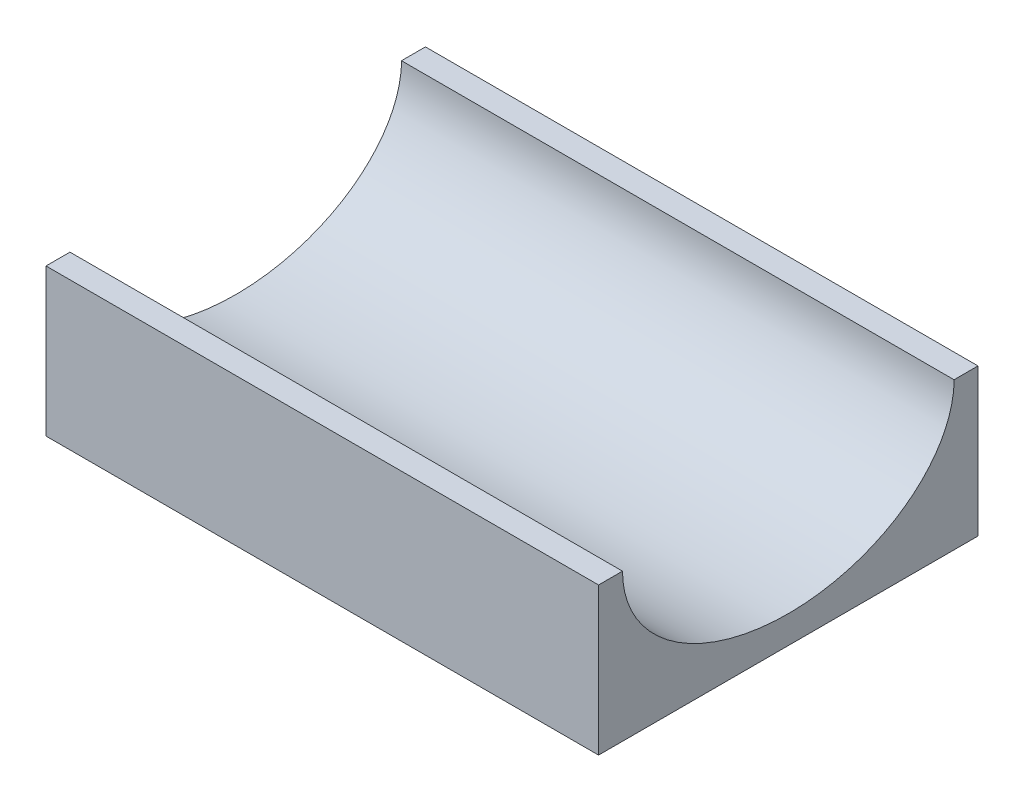
ISO-10303-21;
HEADER;
FILE_DESCRIPTION(('STEP AP214'),'2;1');
FILE_NAME('part.step','',(''),(''),'','','');
FILE_SCHEMA(('AUTOMOTIVE_DESIGN { 1 0 10303 214 1 1 1 1 }'));
ENDSEC;
DATA;
#1=APPLICATION_CONTEXT('core data for automotive mechanical design processes');
#2=APPLICATION_PROTOCOL_DEFINITION('international standard','automotive_design',2000,#1);
#3=PRODUCT_CONTEXT('',#1,'mechanical');
#4=PRODUCT('Part','Part','',(#3));
#5=PRODUCT_RELATED_PRODUCT_CATEGORY('part','',(#4));
#6=PRODUCT_DEFINITION_FORMATION('','',#4);
#7=PRODUCT_DEFINITION_CONTEXT('part definition',#1,'design');
#8=PRODUCT_DEFINITION('design','',#6,#7);
#9=PRODUCT_DEFINITION_SHAPE('','',#8);
#10=(LENGTH_UNIT() NAMED_UNIT(*) SI_UNIT(.MILLI.,.METRE.));
#11=(NAMED_UNIT(*) PLANE_ANGLE_UNIT() SI_UNIT($,.RADIAN.));
#12=(NAMED_UNIT(*) SI_UNIT($,.STERADIAN.) SOLID_ANGLE_UNIT());
#13=UNCERTAINTY_MEASURE_WITH_UNIT(LENGTH_MEASURE(1.E-05),#10,'distance_accuracy_value','');
#14=(GEOMETRIC_REPRESENTATION_CONTEXT(3) GLOBAL_UNCERTAINTY_ASSIGNED_CONTEXT((#13)) GLOBAL_UNIT_ASSIGNED_CONTEXT((#10,
#11,#12)) REPRESENTATION_CONTEXT('',''));
#15=CARTESIAN_POINT('',(0.,0.,0.));
#16=DIRECTION('',(0.,0.,1.));
#17=DIRECTION('',(1.,0.,0.));
#18=AXIS2_PLACEMENT_3D('',#15,#16,#17);
#19=CARTESIAN_POINT('',(0.,-4.7625,0.));
#20=DIRECTION('',(-1.,0.,0.));
#21=DIRECTION('',(0.,0.,1.));
#22=AXIS2_PLACEMENT_3D('',#19,#20,#21);
#23=PLANE('',#22);
#24=CARTESIAN_POINT('',(0.,20.6375,-32.7025));
#25=DIRECTION('',(1.,0.,0.));
#26=DIRECTION('',(0.,0.,1.));
#27=AXIS2_PLACEMENT_3D('',#24,#25,#26);
#28=ELLIPSE('',#27,28.575,20.6375);
#29=CARTESIAN_POINT('',(0.,20.6375,-4.12749999999999));
#30=VERTEX_POINT('',#29);
#31=CARTESIAN_POINT('',(0.,20.6375,-61.2775));
#32=VERTEX_POINT('',#31);
#33=EDGE_CURVE('E121',#30,#32,#28,.T.);
#34=ORIENTED_EDGE('',*,*,#33,.T.);
#35=DIRECTION('',(0.,0.,-1.));
#36=VECTOR('',#35,1.);
#37=CARTESIAN_POINT('',(0.,20.6375,0.));
#38=LINE('',#37,#36);
#39=CARTESIAN_POINT('',(0.,20.6375,-65.405));
#40=VERTEX_POINT('',#39);
#41=EDGE_CURVE('E110',#32,#40,#38,.T.);
#42=ORIENTED_EDGE('',*,*,#41,.T.);
#43=DIRECTION('',(0.,1.,0.));
#44=VECTOR('',#43,1.);
#45=CARTESIAN_POINT('',(0.,-4.7625,-65.405));
#46=LINE('',#45,#44);
#47=CARTESIAN_POINT('',(0.,-4.7625,-65.405));
#48=VERTEX_POINT('',#47);
#49=EDGE_CURVE('E11',#48,#40,#46,.T.);
#50=ORIENTED_EDGE('',*,*,#49,.F.);
#51=DIRECTION('',(0.,0.,1.));
#52=VECTOR('',#51,1.);
#53=CARTESIAN_POINT('',(0.,-4.7625,0.));
#54=LINE('',#53,#52);
#55=CARTESIAN_POINT('',(0.,-4.7625,0.));
#56=VERTEX_POINT('',#55);
#57=EDGE_CURVE('E120',#48,#56,#54,.T.);
#58=ORIENTED_EDGE('',*,*,#57,.T.);
#59=DIRECTION('',(0.,1.,0.));
#60=VECTOR('',#59,1.);
#61=CARTESIAN_POINT('',(0.,-4.7625,0.));
#62=LINE('',#61,#60);
#63=CARTESIAN_POINT('',(0.,20.6375,0.));
#64=VERTEX_POINT('',#63);
#65=EDGE_CURVE('E41',#56,#64,#62,.T.);
#66=ORIENTED_EDGE('',*,*,#65,.T.);
#67=DIRECTION('',(0.,0.,-1.));
#68=VECTOR('',#67,1.);
#69=CARTESIAN_POINT('',(0.,20.6375,0.));
#70=LINE('',#69,#68);
#71=EDGE_CURVE('E117',#64,#30,#70,.T.);
#72=ORIENTED_EDGE('',*,*,#71,.T.);
#73=EDGE_LOOP('',(#34,#42,#50,#58,#66,#72));
#74=FACE_BOUND('',#73,.T.);
#75=ADVANCED_FACE('F38',(#74),#23,.T.);
#76=CARTESIAN_POINT('',(95.25,-4.7625,-65.405));
#77=DIRECTION('',(0.,0.,-1.));
#78=DIRECTION('',(-1.,0.,0.));
#79=AXIS2_PLACEMENT_3D('',#76,#77,#78);
#80=PLANE('',#79);
#81=ORIENTED_EDGE('',*,*,#49,.T.);
#82=DIRECTION('',(-1.,0.,0.));
#83=VECTOR('',#82,1.);
#84=CARTESIAN_POINT('',(133.919883792171,20.6375,-65.405));
#85=LINE('',#84,#83);
#86=CARTESIAN_POINT('',(95.25,20.6375,-65.405));
#87=VERTEX_POINT('',#86);
#88=EDGE_CURVE('E109',#87,#40,#85,.T.);
#89=ORIENTED_EDGE('',*,*,#88,.F.);
#90=DIRECTION('',(0.,1.,0.));
#91=VECTOR('',#90,1.);
#92=CARTESIAN_POINT('',(95.25,-4.7625,-65.405));
#93=LINE('',#92,#91);
#94=CARTESIAN_POINT('',(95.25,-4.7625,-65.405));
#95=VERTEX_POINT('',#94);
#96=EDGE_CURVE('E46',#95,#87,#93,.T.);
#97=ORIENTED_EDGE('',*,*,#96,.F.);
#98=DIRECTION('',(-1.,0.,0.));
#99=VECTOR('',#98,1.);
#100=CARTESIAN_POINT('',(95.25,-4.7625,-65.405));
#101=LINE('',#100,#99);
#102=EDGE_CURVE('E163',#95,#48,#101,.T.);
#103=ORIENTED_EDGE('',*,*,#102,.T.);
#104=EDGE_LOOP('',(#81,#89,#97,#103));
#105=FACE_BOUND('',#104,.T.);
#106=ADVANCED_FACE('F142',(#105),#80,.T.);
#107=CARTESIAN_POINT('',(95.25,-4.7625,0.));
#108=DIRECTION('',(1.,0.,0.));
#109=DIRECTION('',(0.,0.,-1.));
#110=AXIS2_PLACEMENT_3D('',#107,#108,#109);
#111=PLANE('',#110);
#112=ORIENTED_EDGE('',*,*,#96,.T.);
#113=DIRECTION('',(0.,0.,-1.));
#114=VECTOR('',#113,1.);
#115=CARTESIAN_POINT('',(95.25,20.6375,0.));
#116=LINE('',#115,#114);
#117=CARTESIAN_POINT('',(95.25,20.6375,-61.2775));
#118=VERTEX_POINT('',#117);
#119=EDGE_CURVE('E105',#118,#87,#116,.T.);
#120=ORIENTED_EDGE('',*,*,#119,.F.);
#121=CARTESIAN_POINT('',(95.25,20.6375,-32.7025));
#122=DIRECTION('',(1.,0.,0.));
#123=DIRECTION('',(0.,0.,1.));
#124=AXIS2_PLACEMENT_3D('',#121,#122,#123);
#125=ELLIPSE('',#124,28.575,20.6375);
#126=CARTESIAN_POINT('',(95.25,20.6375,-4.12749999999999));
#127=VERTEX_POINT('',#126);
#128=EDGE_CURVE('E92',#127,#118,#125,.T.);
#129=ORIENTED_EDGE('',*,*,#128,.F.);
#130=DIRECTION('',(0.,0.,-1.));
#131=VECTOR('',#130,1.);
#132=CARTESIAN_POINT('',(95.25,20.6375,0.));
#133=LINE('',#132,#131);
#134=CARTESIAN_POINT('',(95.25,20.6375,0.));
#135=VERTEX_POINT('',#134);
#136=EDGE_CURVE('E102',#135,#127,#133,.T.);
#137=ORIENTED_EDGE('',*,*,#136,.F.);
#138=DIRECTION('',(0.,1.,0.));
#139=VECTOR('',#138,1.);
#140=CARTESIAN_POINT('',(95.25,-4.7625,0.));
#141=LINE('',#140,#139);
#142=CARTESIAN_POINT('',(95.25,-4.7625,0.));
#143=VERTEX_POINT('',#142);
#144=EDGE_CURVE('E156',#143,#135,#141,.T.);
#145=ORIENTED_EDGE('',*,*,#144,.F.);
#146=DIRECTION('',(0.,0.,-1.));
#147=VECTOR('',#146,1.);
#148=CARTESIAN_POINT('',(95.25,-4.7625,0.));
#149=LINE('',#148,#147);
#150=EDGE_CURVE('E158',#143,#95,#149,.T.);
#151=ORIENTED_EDGE('',*,*,#150,.T.);
#152=EDGE_LOOP('',(#112,#120,#129,#137,#145,#151));
#153=FACE_BOUND('',#152,.T.);
#154=ADVANCED_FACE('F106',(#153),#111,.T.);
#155=CARTESIAN_POINT('',(95.25,-4.7625,0.));
#156=DIRECTION('',(0.,0.,1.));
#157=DIRECTION('',(1.,0.,0.));
#158=AXIS2_PLACEMENT_3D('',#155,#156,#157);
#159=PLANE('',#158);
#160=ORIENTED_EDGE('',*,*,#144,.T.);
#161=DIRECTION('',(-1.,0.,0.));
#162=VECTOR('',#161,1.);
#163=CARTESIAN_POINT('',(133.919883792171,20.6375,0.));
#164=LINE('',#163,#162);
#165=EDGE_CURVE('E123',#135,#64,#164,.T.);
#166=ORIENTED_EDGE('',*,*,#165,.T.);
#167=ORIENTED_EDGE('',*,*,#65,.F.);
#168=DIRECTION('',(1.,0.,0.));
#169=VECTOR('',#168,1.);
#170=CARTESIAN_POINT('',(95.25,-4.7625,0.));
#171=LINE('',#170,#169);
#172=EDGE_CURVE('E162',#56,#143,#171,.T.);
#173=ORIENTED_EDGE('',*,*,#172,.T.);
#174=EDGE_LOOP('',(#160,#166,#167,#173));
#175=FACE_BOUND('',#174,.T.);
#176=ADVANCED_FACE('F140',(#175),#159,.T.);
#177=CARTESIAN_POINT('',(0.,-4.7625,0.));
#178=DIRECTION('',(0.,1.,0.));
#179=DIRECTION('',(0.,0.,1.));
#180=AXIS2_PLACEMENT_3D('',#177,#178,#179);
#181=PLANE('',#180);
#182=ORIENTED_EDGE('',*,*,#57,.F.);
#183=ORIENTED_EDGE('',*,*,#102,.F.);
#184=ORIENTED_EDGE('',*,*,#150,.F.);
#185=ORIENTED_EDGE('',*,*,#172,.F.);
#186=EDGE_LOOP('',(#182,#183,#184,#185));
#187=FACE_BOUND('',#186,.T.);
#188=ADVANCED_FACE('F136',(#187),#181,.F.);
#189=CARTESIAN_POINT('',(133.919883792171,20.6375,-32.7025));
#190=DIRECTION('',(1.,0.,0.));
#191=DIRECTION('',(0.,0.,1.));
#192=AXIS2_PLACEMENT_3D('',#189,#190,#191);
#193=ELLIPSE('',#192,28.575,20.6375);
#194=DIRECTION('',(-1.,0.,0.));
#195=VECTOR('',#194,1.);
#196=SURFACE_OF_LINEAR_EXTRUSION('',#193,#195);
#197=DIRECTION('',(-1.,0.,0.));
#198=VECTOR('',#197,1.);
#199=CARTESIAN_POINT('',(133.919883792171,20.6375,-4.12749999999999));
#200=LINE('',#199,#198);
#201=EDGE_CURVE('E99',#127,#30,#200,.T.);
#202=ORIENTED_EDGE('',*,*,#201,.F.);
#203=ORIENTED_EDGE('',*,*,#128,.T.);
#204=DIRECTION('',(-1.,0.,0.));
#205=VECTOR('',#204,1.);
#206=CARTESIAN_POINT('',(133.919883792171,20.6375,-61.2775));
#207=LINE('',#206,#205);
#208=EDGE_CURVE('E97',#118,#32,#207,.T.);
#209=ORIENTED_EDGE('',*,*,#208,.T.);
#210=ORIENTED_EDGE('',*,*,#33,.F.);
#211=EDGE_LOOP('',(#202,#203,#209,#210));
#212=FACE_BOUND('',#211,.T.);
#213=ADVANCED_FACE('F94',(#212),#196,.T.);
#214=CARTESIAN_POINT('',(133.919883792171,20.6375,0.));
#215=DIRECTION('',(0.,1.,0.));
#216=DIRECTION('',(0.,0.,1.));
#217=AXIS2_PLACEMENT_3D('',#214,#215,#216);
#218=PLANE('',#217);
#219=ORIENTED_EDGE('',*,*,#165,.F.);
#220=ORIENTED_EDGE('',*,*,#136,.T.);
#221=ORIENTED_EDGE('',*,*,#201,.T.);
#222=ORIENTED_EDGE('',*,*,#71,.F.);
#223=EDGE_LOOP('',(#219,#220,#221,#222));
#224=FACE_BOUND('',#223,.T.);
#225=ADVANCED_FACE('F135',(#224),#218,.T.);
#226=CARTESIAN_POINT('',(133.919883792171,20.6375,0.));
#227=DIRECTION('',(0.,1.,0.));
#228=DIRECTION('',(0.,0.,1.));
#229=AXIS2_PLACEMENT_3D('',#226,#227,#228);
#230=PLANE('',#229);
#231=ORIENTED_EDGE('',*,*,#208,.F.);
#232=ORIENTED_EDGE('',*,*,#119,.T.);
#233=ORIENTED_EDGE('',*,*,#88,.T.);
#234=ORIENTED_EDGE('',*,*,#41,.F.);
#235=EDGE_LOOP('',(#231,#232,#233,#234));
#236=FACE_BOUND('',#235,.T.);
#237=ADVANCED_FACE('F112',(#236),#230,.T.);
#238=CLOSED_SHELL('',(#75,#106,#154,#176,#188,#213,#225,#237));
#239=MANIFOLD_SOLID_BREP('B2',#238);
#240=ADVANCED_BREP_SHAPE_REPRESENTATION('',(#18,#239),#14);
#241=SHAPE_DEFINITION_REPRESENTATION(#9,#240);
ENDSEC;
END-ISO-10303-21;
